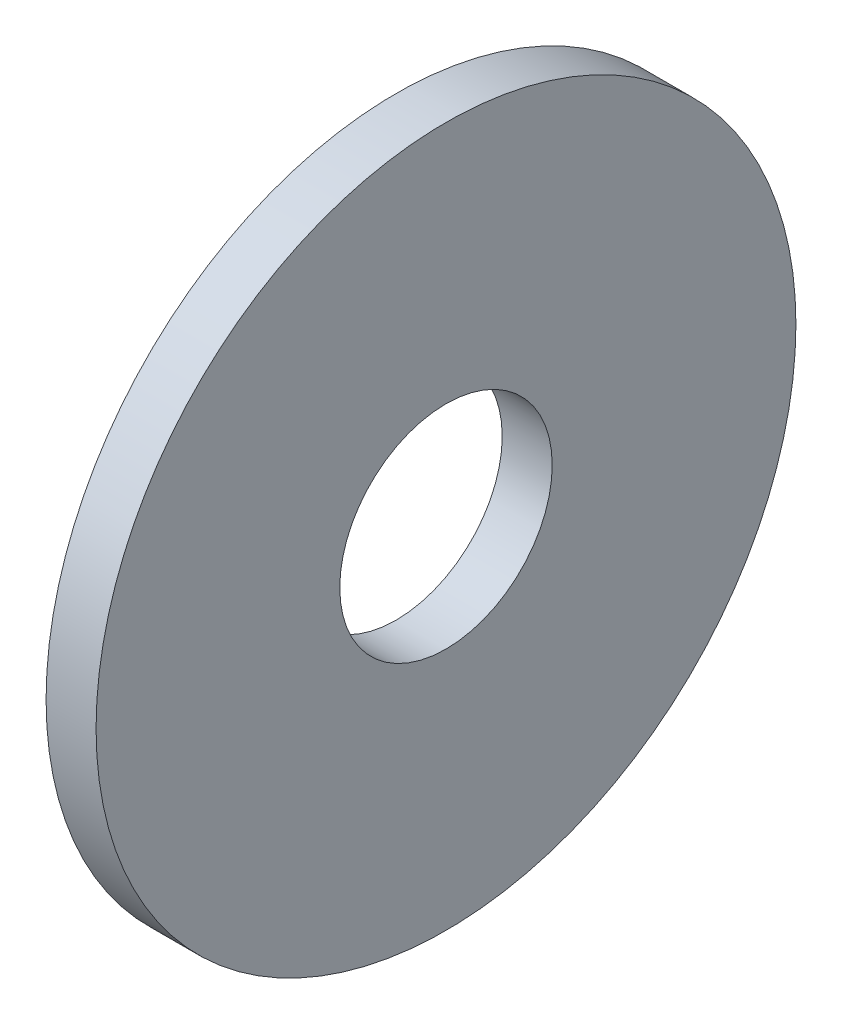
ISO-10303-21;
HEADER;
FILE_DESCRIPTION(('STEP AP214'),'2;1');
FILE_NAME('part.step','',(''),(''),'','','');
FILE_SCHEMA(('AUTOMOTIVE_DESIGN { 1 0 10303 214 1 1 1 1 }'));
ENDSEC;
DATA;
#1=APPLICATION_CONTEXT('core data for automotive mechanical design processes');
#2=APPLICATION_PROTOCOL_DEFINITION('international standard','automotive_design',2000,#1);
#3=PRODUCT_CONTEXT('',#1,'mechanical');
#4=PRODUCT('Part','Part','',(#3));
#5=PRODUCT_RELATED_PRODUCT_CATEGORY('part','',(#4));
#6=PRODUCT_DEFINITION_FORMATION('','',#4);
#7=PRODUCT_DEFINITION_CONTEXT('part definition',#1,'design');
#8=PRODUCT_DEFINITION('design','',#6,#7);
#9=PRODUCT_DEFINITION_SHAPE('','',#8);
#10=(LENGTH_UNIT() NAMED_UNIT(*) SI_UNIT(.MILLI.,.METRE.));
#11=(NAMED_UNIT(*) PLANE_ANGLE_UNIT() SI_UNIT($,.RADIAN.));
#12=(NAMED_UNIT(*) SI_UNIT($,.STERADIAN.) SOLID_ANGLE_UNIT());
#13=UNCERTAINTY_MEASURE_WITH_UNIT(LENGTH_MEASURE(1.E-05),#10,'distance_accuracy_value','');
#14=(GEOMETRIC_REPRESENTATION_CONTEXT(3) GLOBAL_UNCERTAINTY_ASSIGNED_CONTEXT((#13)) GLOBAL_UNIT_ASSIGNED_CONTEXT((#10,
#11,#12)) REPRESENTATION_CONTEXT('',''));
#15=CARTESIAN_POINT('',(0.,0.,0.));
#16=DIRECTION('',(0.,0.,1.));
#17=DIRECTION('',(1.,0.,0.));
#18=AXIS2_PLACEMENT_3D('',#15,#16,#17);
#19=CARTESIAN_POINT('',(1.,0.,0.));
#20=DIRECTION('',(1.,0.,0.));
#21=DIRECTION('',(0.,0.,-1.));
#22=AXIS2_PLACEMENT_3D('',#19,#20,#21);
#23=PLANE('',#22);
#24=CARTESIAN_POINT('',(1.,0.,0.));
#25=DIRECTION('',(1.,0.,0.));
#26=DIRECTION('',(0.,0.,-1.));
#27=AXIS2_PLACEMENT_3D('',#24,#25,#26);
#28=CIRCLE('',#27,14.);
#29=CARTESIAN_POINT('',(1.,0.,-14.));
#30=VERTEX_POINT('',#29);
#31=EDGE_CURVE('E10',#30,#30,#28,.T.);
#32=ORIENTED_EDGE('',*,*,#31,.T.);
#33=EDGE_LOOP('',(#32));
#34=FACE_BOUND('',#33,.T.);
#35=CARTESIAN_POINT('',(1.,0.,0.));
#36=DIRECTION('',(1.,0.,0.));
#37=DIRECTION('',(0.,0.,-1.));
#38=AXIS2_PLACEMENT_3D('',#35,#36,#37);
#39=CIRCLE('',#38,4.25);
#40=CARTESIAN_POINT('',(1.,0.,-4.25));
#41=VERTEX_POINT('',#40);
#42=EDGE_CURVE('E41',#41,#41,#39,.T.);
#43=ORIENTED_EDGE('',*,*,#42,.F.);
#44=EDGE_LOOP('',(#43));
#45=FACE_BOUND('',#44,.T.);
#46=ADVANCED_FACE('F30',(#34,#45),#23,.T.);
#47=CARTESIAN_POINT('',(-1.,0.,0.));
#48=DIRECTION('',(1.,0.,0.));
#49=DIRECTION('',(0.,0.,-1.));
#50=AXIS2_PLACEMENT_3D('',#47,#48,#49);
#51=PLANE('',#50);
#52=CARTESIAN_POINT('',(-1.,0.,0.));
#53=DIRECTION('',(1.,0.,0.));
#54=DIRECTION('',(0.,0.,-1.));
#55=AXIS2_PLACEMENT_3D('',#52,#53,#54);
#56=CIRCLE('',#55,14.);
#57=CARTESIAN_POINT('',(-1.,0.,-14.));
#58=VERTEX_POINT('',#57);
#59=EDGE_CURVE('E34',#58,#58,#56,.T.);
#60=ORIENTED_EDGE('',*,*,#59,.F.);
#61=EDGE_LOOP('',(#60));
#62=FACE_BOUND('',#61,.T.);
#63=CARTESIAN_POINT('',(-1.,0.,0.));
#64=DIRECTION('',(1.,0.,0.));
#65=DIRECTION('',(0.,0.,-1.));
#66=AXIS2_PLACEMENT_3D('',#63,#64,#65);
#67=CIRCLE('',#66,4.25);
#68=CARTESIAN_POINT('',(-1.,0.,-4.25));
#69=VERTEX_POINT('',#68);
#70=EDGE_CURVE('E43',#69,#69,#67,.T.);
#71=ORIENTED_EDGE('',*,*,#70,.T.);
#72=EDGE_LOOP('',(#71));
#73=FACE_BOUND('',#72,.T.);
#74=ADVANCED_FACE('F53',(#62,#73),#51,.F.);
#75=CARTESIAN_POINT('',(1.,0.,0.));
#76=DIRECTION('',(-1.,0.,0.));
#77=DIRECTION('',(0.,0.,1.));
#78=AXIS2_PLACEMENT_3D('',#75,#76,#77);
#79=CYLINDRICAL_SURFACE('',#78,14.);
#80=ORIENTED_EDGE('',*,*,#31,.F.);
#81=EDGE_LOOP('',(#80));
#82=FACE_BOUND('',#81,.T.);
#83=ORIENTED_EDGE('',*,*,#59,.T.);
#84=EDGE_LOOP('',(#83));
#85=FACE_BOUND('',#84,.T.);
#86=ADVANCED_FACE('F32',(#82,#85),#79,.T.);
#87=CARTESIAN_POINT('',(1.,0.,0.));
#88=DIRECTION('',(-1.,0.,0.));
#89=DIRECTION('',(0.,0.,1.));
#90=AXIS2_PLACEMENT_3D('',#87,#88,#89);
#91=CYLINDRICAL_SURFACE('',#90,4.25);
#92=ORIENTED_EDGE('',*,*,#42,.T.);
#93=EDGE_LOOP('',(#92));
#94=FACE_BOUND('',#93,.T.);
#95=ORIENTED_EDGE('',*,*,#70,.F.);
#96=EDGE_LOOP('',(#95));
#97=FACE_BOUND('',#96,.T.);
#98=ADVANCED_FACE('F49',(#94,#97),#91,.F.);
#99=CLOSED_SHELL('',(#46,#74,#86,#98));
#100=MANIFOLD_SOLID_BREP('B2',#99);
#101=ADVANCED_BREP_SHAPE_REPRESENTATION('',(#18,#100),#14);
#102=SHAPE_DEFINITION_REPRESENTATION(#9,#101);
ENDSEC;
END-ISO-10303-21;
